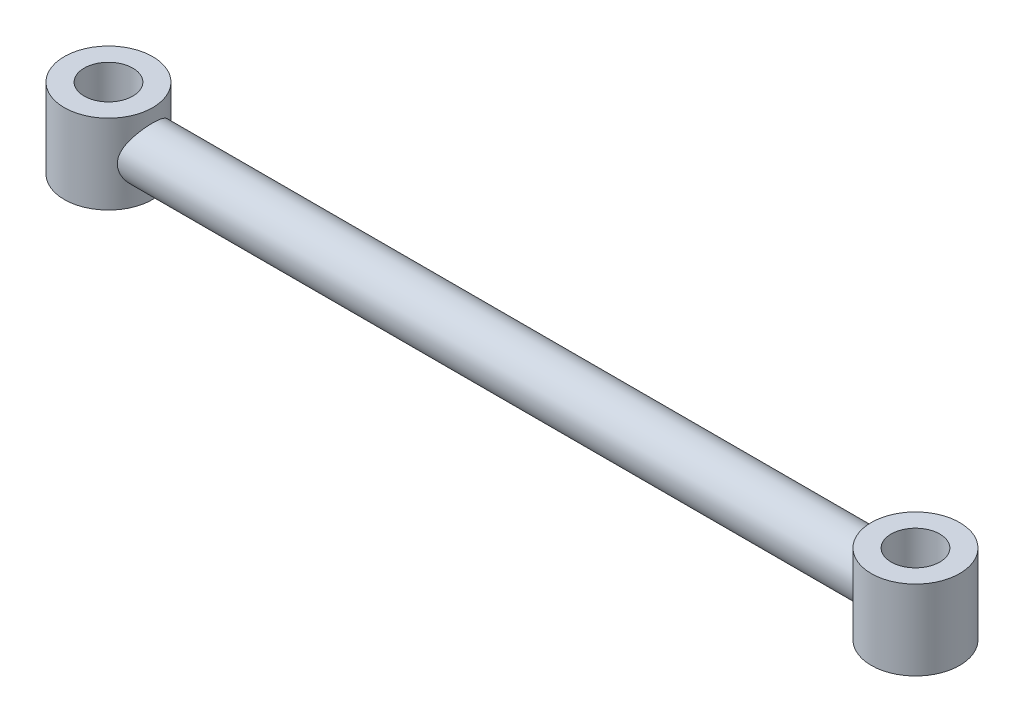
ISO-10303-21;
HEADER;
FILE_DESCRIPTION(('STEP AP214'),'2;1');
FILE_NAME('part.step','',(''),(''),'','','');
FILE_SCHEMA(('AUTOMOTIVE_DESIGN { 1 0 10303 214 1 1 1 1 }'));
ENDSEC;
DATA;
#1=APPLICATION_CONTEXT('core data for automotive mechanical design processes');
#2=APPLICATION_PROTOCOL_DEFINITION('international standard','automotive_design',2000,#1);
#3=PRODUCT_CONTEXT('',#1,'mechanical');
#4=PRODUCT('Part','Part','',(#3));
#5=PRODUCT_RELATED_PRODUCT_CATEGORY('part','',(#4));
#6=PRODUCT_DEFINITION_FORMATION('','',#4);
#7=PRODUCT_DEFINITION_CONTEXT('part definition',#1,'design');
#8=PRODUCT_DEFINITION('design','',#6,#7);
#9=PRODUCT_DEFINITION_SHAPE('','',#8);
#10=(LENGTH_UNIT() NAMED_UNIT(*) SI_UNIT(.MILLI.,.METRE.));
#11=(NAMED_UNIT(*) PLANE_ANGLE_UNIT() SI_UNIT($,.RADIAN.));
#12=(NAMED_UNIT(*) SI_UNIT($,.STERADIAN.) SOLID_ANGLE_UNIT());
#13=UNCERTAINTY_MEASURE_WITH_UNIT(LENGTH_MEASURE(1.E-05),#10,'distance_accuracy_value','');
#14=(GEOMETRIC_REPRESENTATION_CONTEXT(3) GLOBAL_UNCERTAINTY_ASSIGNED_CONTEXT((#13)) GLOBAL_UNIT_ASSIGNED_CONTEXT((#10,
#11,#12)) REPRESENTATION_CONTEXT('',''));
#15=CARTESIAN_POINT('',(0.,0.,0.));
#16=DIRECTION('',(0.,0.,1.));
#17=DIRECTION('',(1.,0.,0.));
#18=AXIS2_PLACEMENT_3D('',#15,#16,#17);
#19=CARTESIAN_POINT('',(182.5,0.,0.));
#20=DIRECTION('',(-1.,0.,0.));
#21=DIRECTION('',(0.,0.,1.));
#22=AXIS2_PLACEMENT_3D('',#19,#20,#21);
#23=CYLINDRICAL_SURFACE('',#22,12.);
#24=CARTESIAN_POINT('',(166.5,0.,12.));
#25=CARTESIAN_POINT('',(166.500002828967,-0.301908400688165,12.0000019238863));
#26=CARTESIAN_POINT('',(166.491423778045,-0.603795511520365,11.9885900087755));
#27=CARTESIAN_POINT('',(166.457502284021,-1.20488924542274,11.9431600202484));
#28=CARTESIAN_POINT('',(166.432160956955,-1.50409604560474,11.9091434518566));
#29=CARTESIAN_POINT('',(166.365779977744,-2.09765466722186,11.8190547923861));
#30=CARTESIAN_POINT('',(166.324725981522,-2.39200179539109,11.7629625471233));
#31=CARTESIAN_POINT('',(166.228571023156,-2.97349307991005,11.6295889328939));
#32=CARTESIAN_POINT('',(166.173469326672,-3.2606368588455,11.5523064562006));
#33=CARTESIAN_POINT('',(166.05168053024,-3.82391010602119,11.3782233898699));
#34=CARTESIAN_POINT('',(165.985083944408,-4.10010631241352,11.2815744063395));
#35=CARTESIAN_POINT('',(165.842106390334,-4.64262215814439,11.069369621002));
#36=CARTESIAN_POINT('',(165.765721522804,-4.90893780661706,10.9538062793017));
#37=CARTESIAN_POINT('',(165.605320398224,-5.43063769131154,10.7047527337694));
#38=CARTESIAN_POINT('',(165.521304115564,-5.68602189084302,10.5712624697737));
#39=CARTESIAN_POINT('',(165.347720367253,-6.18509809639777,10.2872252569974));
#40=CARTESIAN_POINT('',(165.258153262676,-6.4287908611111,10.1366794171379));
#41=CARTESIAN_POINT('',(165.064247886216,-6.93296744164812,9.7998357530252));
#42=CARTESIAN_POINT('',(164.959443242611,-7.19185705595307,9.61141728863257));
#43=CARTESIAN_POINT('',(164.747945976981,-7.6933159594402,9.21493722581117));
#44=CARTESIAN_POINT('',(164.641253227829,-7.93588414437564,9.00687430059582));
#45=CARTESIAN_POINT('',(164.428363009524,-8.40402030337025,8.57173550519701));
#46=CARTESIAN_POINT('',(164.322166073095,-8.62957276681466,8.34464267698865));
#47=CARTESIAN_POINT('',(164.112764143814,-9.06235556929377,7.87249861734411));
#48=CARTESIAN_POINT('',(164.009558136086,-9.26959217333667,7.62745357939243));
#49=CARTESIAN_POINT('',(163.797439169499,-9.68614025039818,7.092648996584));
#50=CARTESIAN_POINT('',(163.689121083317,-9.89323949346852,6.80092220851909));
#51=CARTESIAN_POINT('',(163.4818473623,-10.2818845047161,6.19770739835052));
#52=CARTESIAN_POINT('',(163.382892578599,-10.4634279505762,5.88621758405922));
#53=CARTESIAN_POINT('',(163.197247883637,-10.7988768856772,5.24546661918502));
#54=CARTESIAN_POINT('',(163.110549431346,-10.9528016418071,4.91621806733496));
#55=CARTESIAN_POINT('',(162.951983247807,-11.2311195931322,4.24203715195801));
#56=CARTESIAN_POINT('',(162.880113079609,-11.3555176413926,3.89710737694668));
#57=CARTESIAN_POINT('',(162.759569334717,-11.5624812778385,3.22795776425264));
#58=CARTESIAN_POINT('',(162.709336763554,-11.6479057862703,2.90490213290751));
#59=CARTESIAN_POINT('',(162.624324220016,-11.7917710665595,2.25082759614568));
#60=CARTESIAN_POINT('',(162.589543351758,-11.8502134028396,1.91980915358284));
#61=CARTESIAN_POINT('',(162.536488129066,-11.9391406335387,1.25298686812477));
#62=CARTESIAN_POINT('',(162.518200850477,-11.9696474181686,0.917186981873278));
#63=CARTESIAN_POINT('',(162.49864927495,-12.0022585112917,0.243729085676189));
#64=CARTESIAN_POINT('',(162.497383246063,-12.0043657095045,-0.0939287317231014));
#65=CARTESIAN_POINT('',(162.510998662594,-11.9816620001252,-0.725958119822381));
#66=CARTESIAN_POINT('',(162.523894673691,-11.9601608950351,-1.02049867081488));
#67=CARTESIAN_POINT('',(162.562452249791,-11.8956497579643,-1.60634317671335));
#68=CARTESIAN_POINT('',(162.588112499583,-11.8526419420081,-1.89764746191961));
#69=CARTESIAN_POINT('',(162.651609133523,-11.7456574840718,-2.47502497127977));
#70=CARTESIAN_POINT('',(162.689445954131,-11.681680090454,-2.76109800753568));
#71=CARTESIAN_POINT('',(162.776456076012,-11.5335067985196,-3.32619184187788));
#72=CARTESIAN_POINT('',(162.825629844392,-11.449310067115,-3.60521234885843));
#73=CARTESIAN_POINT('',(162.934570954697,-11.2610805390842,-4.15611235529148));
#74=CARTESIAN_POINT('',(162.994395222524,-11.1569409112312,-4.42794398767527));
#75=CARTESIAN_POINT('',(163.123258799191,-10.9300876072086,-4.96158056062547));
#76=CARTESIAN_POINT('',(163.192301385931,-10.8073673219387,-5.22338189174885));
#77=CARTESIAN_POINT('',(163.3382427822,-10.5444249206125,-5.73567682875735));
#78=CARTESIAN_POINT('',(163.415140075837,-10.4042061804551,-5.98617260311445));
#79=CARTESIAN_POINT('',(163.575420774502,-10.1071922231712,-6.47506872936967));
#80=CARTESIAN_POINT('',(163.658806501249,-9.9503910651754,-6.71346470077727));
#81=CARTESIAN_POINT('',(163.84082877763,-9.60153051105111,-7.2049947479175));
#82=CARTESIAN_POINT('',(163.940098019099,-9.40749645244502,-7.45649461200061));
#83=CARTESIAN_POINT('',(164.142773675002,-9.00104402075896,-7.94238968684768));
#84=CARTESIAN_POINT('',(164.246180395382,-8.788624286791,-8.17678362907875));
#85=CARTESIAN_POINT('',(164.455066071919,-8.34612135221813,-8.62799224234946));
#86=CARTESIAN_POINT('',(164.560547796082,-8.11601317196708,-8.8447811295483));
#87=CARTESIAN_POINT('',(164.771080063517,-7.63939133410778,-9.25956168795246));
#88=CARTESIAN_POINT('',(164.876130720468,-7.39288234224229,-9.45755866656125));
#89=CARTESIAN_POINT('',(165.095439038822,-6.85463170108886,-9.85590025313088));
#90=CARTESIAN_POINT('',(165.209347630861,-6.5609628730421,-10.053842826191));
#91=CARTESIAN_POINT('',(165.429993532283,-5.95522167682575,-10.4240751420533));
#92=CARTESIAN_POINT('',(165.536729660883,-5.64314629423663,-10.5963606666551));
#93=CARTESIAN_POINT('',(165.73896914915,-5.00243922366782,-10.913439641307));
#94=CARTESIAN_POINT('',(165.834489257744,-4.67383329669938,-11.0582742877405));
#95=CARTESIAN_POINT('',(166.010411997374,-4.00145187975437,-11.3189334736486));
#96=CARTESIAN_POINT('',(166.090820563945,-3.65768241152237,-11.4347694092443));
#97=CARTESIAN_POINT('',(166.215017364332,-3.04421360115854,-11.610679227564));
#98=CARTESIAN_POINT('',(166.262943010653,-2.7772577564668,-11.6774582470828));
#99=CARTESIAN_POINT('',(166.346496360172,-2.23756206684686,-11.7927693223011));
#100=CARTESIAN_POINT('',(166.382126787049,-1.9648235171511,-11.8413054194481));
#101=CARTESIAN_POINT('',(166.439829514199,-1.41548658277408,-11.9194501178543));
#102=CARTESIAN_POINT('',(166.461914828154,-1.13889216487325,-11.9490768876656));
#103=CARTESIAN_POINT('',(166.491763603535,-0.583526491869241,-11.9890365294492));
#104=CARTESIAN_POINT('',(166.499526761228,-0.304755190726258,-11.9993689922423));
#105=CARTESIAN_POINT('',(166.500431770705,0.253237187593743,-12.0005757169308));
#106=CARTESIAN_POINT('',(166.493553494723,0.53245835597042,-11.9914231925614));
#107=CARTESIAN_POINT('',(166.465400259443,1.08885114664406,-11.9537507574613));
#108=CARTESIAN_POINT('',(166.444125225159,1.36602275825806,-11.9252307458526));
#109=CARTESIAN_POINT('',(166.387953795293,1.91652811099207,-11.8492273938988));
#110=CARTESIAN_POINT('',(166.353048249553,2.18985914597287,-11.8017313144283));
#111=CARTESIAN_POINT('',(166.270838588812,2.73078140678314,-11.6884218683725));
#112=CARTESIAN_POINT('',(166.223534125508,2.99837247114031,-11.6226079872113));
#113=CARTESIAN_POINT('',(166.118125357712,3.52598231681507,-11.4735560828406));
#114=CARTESIAN_POINT('',(166.060038093048,3.78601230703067,-11.3903455253838));
#115=CARTESIAN_POINT('',(165.934660962492,4.29791560248682,-11.2072231395973));
#116=CARTESIAN_POINT('',(165.867368081331,4.54978620157477,-11.1073058366358));
#117=CARTESIAN_POINT('',(165.725307540906,5.04444759186843,-10.8915731783922));
#118=CARTESIAN_POINT('',(165.650539346416,5.28723773120911,-10.775756684521));
#119=CARTESIAN_POINT('',(165.495228731342,5.76305724420511,-10.5289606559558));
#120=CARTESIAN_POINT('',(165.41468599606,5.99608608479612,-10.3979802946296));
#121=CARTESIAN_POINT('',(165.23454449726,6.49298270755893,-10.0965427477609));
#122=CARTESIAN_POINT('',(165.134130183473,6.75482499152477,-9.92322733749157));
#123=CARTESIAN_POINT('',(164.930112321563,7.26327586936484,-9.55734884117474));
#124=CARTESIAN_POINT('',(164.826509294188,7.50988693107224,-9.36478888652449));
#125=CARTESIAN_POINT('',(164.618386928431,7.98738394680929,-8.9610015580484));
#126=CARTESIAN_POINT('',(164.513866775548,8.21825388811033,-8.7497556631375));
#127=CARTESIAN_POINT('',(164.306288128255,8.66313204976566,-8.30951773338647));
#128=CARTESIAN_POINT('',(164.203229709788,8.8771393966482,-8.08052478047704));
#129=CARTESIAN_POINT('',(163.98755313403,9.31404007325761,-7.57459119140597));
#130=CARTESIAN_POINT('',(163.875438259814,9.53446002805125,-7.29529028077707));
#131=CARTESIAN_POINT('',(163.658864142421,9.95088052545973,-6.71618728275076));
#132=CARTESIAN_POINT('',(163.554405683304,10.1468785685664,-6.41638310176176));
#133=CARTESIAN_POINT('',(163.356092814026,10.512504885732,-5.79794763548483));
#134=CARTESIAN_POINT('',(163.262233341347,10.6821457637524,-5.47932545017127));
#135=CARTESIAN_POINT('',(163.087811564895,10.993163432372,-4.82508968441392));
#136=CARTESIAN_POINT('',(163.007247448531,11.1345440763211,-4.4894784283018));
#137=CARTESIAN_POINT('',(162.867193825242,11.3778836757959,-3.82865235869636));
#138=CARTESIAN_POINT('',(162.806598863199,11.4819596087315,-3.50445198667871));
#139=CARTESIAN_POINT('',(162.700723587406,11.6626203187524,-2.84601413660251));
#140=CARTESIAN_POINT('',(162.655442703987,11.7392061184527,-2.51177703240517));
#141=CARTESIAN_POINT('',(162.581602248055,11.8636029123524,-1.83648767445476));
#142=CARTESIAN_POINT('',(162.553026927423,11.911441007835,-1.49544215364405));
#143=CARTESIAN_POINT('',(162.513437970259,11.9776197892116,-0.809503452327046));
#144=CARTESIAN_POINT('',(162.502422044393,11.9959643203756,-0.464610779304203));
#145=CARTESIAN_POINT('',(162.498568153475,12.0023854738157,0.179455347832177));
#146=CARTESIAN_POINT('',(162.503500102786,11.9941753490818,0.478586599494673));
#147=CARTESIAN_POINT('',(162.526676343111,11.95549677696,1.07486280744656));
#148=CARTESIAN_POINT('',(162.544919192077,11.9250307406838,1.37200797538116));
#149=CARTESIAN_POINT('',(162.594279638013,11.8422465516967,1.96213810956105));
#150=CARTESIAN_POINT('',(162.625397145158,11.7899285514456,2.25512310481685));
#151=CARTESIAN_POINT('',(162.699782501151,11.6640981837945,2.83492894826243));
#152=CARTESIAN_POINT('',(162.743050714151,11.5905851811864,3.12174961143206));
#153=CARTESIAN_POINT('',(162.839981044523,11.4245704054237,3.68285438672594));
#154=CARTESIAN_POINT('',(162.893464258702,11.3323940332569,3.95726608711425));
#155=CARTESIAN_POINT('',(163.010153824482,11.1292862018814,4.49689980989541));
#156=CARTESIAN_POINT('',(163.073359936012,11.0183552057406,4.76212205898894));
#157=CARTESIAN_POINT('',(163.208262727439,10.7787258735032,5.28214279400182));
#158=CARTESIAN_POINT('',(163.27995906437,10.6500282550613,5.53694170041705));
#159=CARTESIAN_POINT('',(163.430544737693,10.3758015523862,6.03520075148304));
#160=CARTESIAN_POINT('',(163.509436676335,10.2302663737908,6.27865674555706));
#161=CARTESIAN_POINT('',(163.681854860864,9.90673029466417,6.77899616744094));
#162=CARTESIAN_POINT('',(163.776041000191,9.72692044563403,7.03448334572756));
#163=CARTESIAN_POINT('',(163.969586441422,9.348935360204,7.52957259033478));
#164=CARTESIAN_POINT('',(164.068948052154,9.15075189586933,7.76916745668792));
#165=CARTESIAN_POINT('',(164.270849038489,8.73696672133491,8.23175510218865));
#166=CARTESIAN_POINT('',(164.373390935028,8.52135096358474,8.45473420807131));
#167=CARTESIAN_POINT('',(164.579446849445,8.07376590231618,8.88314617589317));
#168=CARTESIAN_POINT('',(164.682960919514,7.84179571643316,9.08857808979053));
#169=CARTESIAN_POINT('',(164.901799698455,7.33186369501143,9.50608800522032));
#170=CARTESIAN_POINT('',(165.016955336288,7.05180187068934,9.71569839772613));
#171=CARTESIAN_POINT('',(165.24227883175,6.47302014608167,10.110526392104));
#172=CARTESIAN_POINT('',(165.352446082999,6.17429798793025,10.2957410336743));
#173=CARTESIAN_POINT('',(165.564113623133,5.55945257539292,10.6403306545097));
#174=CARTESIAN_POINT('',(165.665616206628,5.24333396470237,10.7997124850301));
#175=CARTESIAN_POINT('',(165.85610626905,4.59511438969121,11.0910374795193));
#176=CARTESIAN_POINT('',(165.945097146565,4.26301779853903,11.2229880993829));
#177=CARTESIAN_POINT('',(166.099761007668,3.61366723599436,11.4476706777274));
#178=CARTESIAN_POINT('',(166.166774787697,3.29755988906652,11.5427864370199));
#179=CARTESIAN_POINT('',(166.284176385264,2.65563921316369,11.7071473361555));
#180=CARTESIAN_POINT('',(166.334565559927,2.32982667882558,11.7763945877959));
#181=CARTESIAN_POINT('',(166.416199252775,1.67181932077724,11.8876462704885));
#182=CARTESIAN_POINT('',(166.447479356206,1.33963755562275,11.929701347867));
#183=CARTESIAN_POINT('',(166.489376856324,0.671628104783217,11.9858753847844));
#184=CARTESIAN_POINT('',(166.499996853451,0.33580088329448,11.9999978601366));
#185=CARTESIAN_POINT('',(166.5,0.,12.));
#186=B_SPLINE_CURVE_WITH_KNOTS('',3,(#24,#25,#26,#27,#28,#29,#30,#31,#32,#33,#34,#35,#36,#37,
#38,#39,#40,#41,#42,#43,#44,#45,#46,#47,#48,#49,#50,#51,#52,#53,#54,#55,#56,#57,#58,#59,#60,#61,
#62,#63,#64,#65,#66,#67,#68,#69,#70,#71,#72,#73,#74,#75,#76,#77,#78,#79,#80,#81,#82,#83,#84,#85,
#86,#87,#88,#89,#90,#91,#92,#93,#94,#95,#96,#97,#98,#99,#100,#101,#102,#103,#104,#105,#106,#107,
#108,#109,#110,#111,#112,#113,#114,#115,#116,#117,#118,#119,#120,#121,#122,#123,#124,#125,#126,
#127,#128,#129,#130,#131,#132,#133,#134,#135,#136,#137,#138,#139,#140,#141,#142,#143,#144,#145,
#146,#147,#148,#149,#150,#151,#152,#153,#154,#155,#156,#157,#158,#159,#160,#161,#162,#163,#164,
#165,#166,#167,#168,#169,#170,#171,#172,#173,#174,#175,#176,#177,#178,#179,#180,#181,#182,#183,
#184,#185),.UNSPECIFIED.,.T.,.F.,(4,2,2,2,2,2,2,2,2,2,2,2,2,2,2,2,2,2,2,2,2,2,2,2,2,2,2,2,2,2,2,
2,2,2,2,2,2,2,2,2,2,2,2,2,2,2,2,2,2,2,2,2,2,2,2,2,2,2,2,2,2,2,2,2,2,2,2,2,2,2,2,2,2,2,2,2,2,2,2,
2,4),(0.,0.905356263906157,1.81065225495962,2.71677666841302,3.62294845886141,4.5222857029527,
5.42198232992236,6.32168197639813,7.22132315964398,8.23104850867394,9.24084210338854,
10.2515453198908,11.2619014726687,12.3818273656142,13.5018549633308,14.6210981623429,
15.7401572728519,16.752441440934,17.7646669095416,18.7760985210015,19.7874272163241,
20.673184190002,21.5588499151895,22.4445473898195,23.3302813636901,24.2208999819286,
25.1118361387938,26.0026006762698,26.8936854299543,27.8910660053599,28.8885204690439,
29.8874103738016,30.8860173170441,32.0006941039487,33.1155539497671,34.2287272083442,
35.3414623149551,36.1785892140744,37.0155305507444,37.8516665179444,38.6878202170862,
39.5251241297566,40.3624324036609,41.2003037313291,42.0381985984997,42.8747804598504,
43.7116369998239,44.5485535009134,45.3855156465696,46.3735461495525,47.3614161450078,
48.3502765083028,49.3391880603129,50.456908004688,51.5747422504905,52.6920402932018,
53.8091858855997,54.8452180584315,55.881211687547,56.9162271173945,57.9511075945252,
58.8478548614564,59.7445049929725,60.6411488687215,61.5378196194258,62.4200276697994,
63.3022139408792,64.1843645878562,65.0668355344903,66.044765107921,67.0231347454681,
68.002300799585,68.9815197227868,70.0850618258241,71.1887377150264,72.2921204118897,
73.3952028124034,74.4042890325313,75.413292857043,76.4204119233386,77.427404217766),.UNSPECIFIED.);
#187=CARTESIAN_POINT('',(166.5,0.,12.));
#188=VERTEX_POINT('',#187);
#189=EDGE_CURVE('E43',#188,#188,#186,.T.);
#190=ORIENTED_EDGE('',*,*,#189,.F.);
#191=EDGE_LOOP('',(#190));
#192=FACE_BOUND('',#191,.T.);
#193=CARTESIAN_POINT('',(-166.5,0.,12.));
#194=CARTESIAN_POINT('',(-166.500002828967,0.301908400688168,12.0000019238863));
#195=CARTESIAN_POINT('',(-166.491423778045,0.603795511520371,11.9885900087755));
#196=CARTESIAN_POINT('',(-166.457502284021,1.20488924542275,11.9431600202484));
#197=CARTESIAN_POINT('',(-166.432160956955,1.50409604560475,11.9091434518566));
#198=CARTESIAN_POINT('',(-166.365779977743,2.09765466722188,11.8190547923861));
#199=CARTESIAN_POINT('',(-166.324725981522,2.39200179539111,11.7629625471233));
#200=CARTESIAN_POINT('',(-166.228571023155,2.97349307991007,11.6295889328939));
#201=CARTESIAN_POINT('',(-166.173469326672,3.26063685884552,11.5523064562006));
#202=CARTESIAN_POINT('',(-166.05168053024,3.82391010602121,11.3782233898699));
#203=CARTESIAN_POINT('',(-165.985083944408,4.10010631241354,11.2815744063395));
#204=CARTESIAN_POINT('',(-165.842106390334,4.64262215814441,11.069369621002));
#205=CARTESIAN_POINT('',(-165.765721522803,4.90893780661708,10.9538062793017));
#206=CARTESIAN_POINT('',(-165.605320398224,5.43063769131156,10.7047527337694));
#207=CARTESIAN_POINT('',(-165.521304115564,5.68602189084304,10.5712624697737));
#208=CARTESIAN_POINT('',(-165.347720367252,6.18509809639779,10.2872252569974));
#209=CARTESIAN_POINT('',(-165.258153262676,6.42879086111113,10.1366794171379));
#210=CARTESIAN_POINT('',(-165.064247886216,6.93296744164815,9.79983575302517));
#211=CARTESIAN_POINT('',(-164.959443242611,7.1918570559531,9.61141728863255));
#212=CARTESIAN_POINT('',(-164.74794597698,7.69331595944023,9.21493722581114));
#213=CARTESIAN_POINT('',(-164.641253227828,7.93588414437566,9.0068743005958));
#214=CARTESIAN_POINT('',(-164.428363009524,8.40402030337027,8.57173550519699));
#215=CARTESIAN_POINT('',(-164.322166073095,8.62957276681468,8.34464267698862));
#216=CARTESIAN_POINT('',(-164.112764143813,9.0623555692938,7.87249861734408));
#217=CARTESIAN_POINT('',(-164.009558136085,9.26959217333669,7.62745357939239));
#218=CARTESIAN_POINT('',(-163.797439169498,9.68614025039821,7.09264899658396));
#219=CARTESIAN_POINT('',(-163.689121083317,9.89323949346856,6.80092220851904));
#220=CARTESIAN_POINT('',(-163.4818473623,10.2818845047161,6.19770739835046));
#221=CARTESIAN_POINT('',(-163.382892578599,10.4634279505762,5.88621758405916));
#222=CARTESIAN_POINT('',(-163.197247883637,10.7988768856772,5.24546661918496));
#223=CARTESIAN_POINT('',(-163.110549431346,10.9528016418072,4.9162180673349));
#224=CARTESIAN_POINT('',(-162.951983247807,11.2311195931322,4.24203715195794));
#225=CARTESIAN_POINT('',(-162.880113079608,11.3555176413926,3.89710737694662));
#226=CARTESIAN_POINT('',(-162.759569334717,11.5624812778385,3.22795776425259));
#227=CARTESIAN_POINT('',(-162.709336763554,11.6479057862703,2.90490213290745));
#228=CARTESIAN_POINT('',(-162.624324220016,11.7917710665595,2.25082759614563));
#229=CARTESIAN_POINT('',(-162.589543351758,11.8502134028396,1.91980915358279));
#230=CARTESIAN_POINT('',(-162.536488129066,11.9391406335387,1.25298686812473));
#231=CARTESIAN_POINT('',(-162.518200850476,11.9696474181686,0.917186981873233));
#232=CARTESIAN_POINT('',(-162.498649274949,12.0022585112917,0.243729085676149));
#233=CARTESIAN_POINT('',(-162.497383246063,12.0043657095045,-0.0939287317231403));
#234=CARTESIAN_POINT('',(-162.510998662594,11.9816620001252,-0.725958119822416));
#235=CARTESIAN_POINT('',(-162.523894673691,11.9601608950351,-1.02049867081491));
#236=CARTESIAN_POINT('',(-162.562452249791,11.8956497579643,-1.60634317671338));
#237=CARTESIAN_POINT('',(-162.588112499582,11.8526419420081,-1.89764746191964));
#238=CARTESIAN_POINT('',(-162.651609133523,11.7456574840718,-2.4750249712798));
#239=CARTESIAN_POINT('',(-162.689445954131,11.681680090454,-2.7610980075357));
#240=CARTESIAN_POINT('',(-162.776456076011,11.5335067985196,-3.3261918418779));
#241=CARTESIAN_POINT('',(-162.825629844392,11.449310067115,-3.60521234885845));
#242=CARTESIAN_POINT('',(-162.934570954697,11.2610805390842,-4.1561123552915));
#243=CARTESIAN_POINT('',(-162.994395222523,11.1569409112312,-4.42794398767527));
#244=CARTESIAN_POINT('',(-163.12325879919,10.9300876072086,-4.96158056062547));
#245=CARTESIAN_POINT('',(-163.192301385931,10.8073673219387,-5.22338189174884));
#246=CARTESIAN_POINT('',(-163.3382427822,10.5444249206125,-5.73567682875734));
#247=CARTESIAN_POINT('',(-163.415140075837,10.4042061804551,-5.98617260311445));
#248=CARTESIAN_POINT('',(-163.575420774502,10.1071922231712,-6.47506872936966));
#249=CARTESIAN_POINT('',(-163.658806501249,9.95039106517539,-6.71346470077727));
#250=CARTESIAN_POINT('',(-163.84082877763,9.6015305110511,-7.2049947479175));
#251=CARTESIAN_POINT('',(-163.940098019099,9.40749645244501,-7.45649461200062));
#252=CARTESIAN_POINT('',(-164.142773675002,9.00104402075895,-7.94238968684769));
#253=CARTESIAN_POINT('',(-164.246180395382,8.78862428679099,-8.17678362907875));
#254=CARTESIAN_POINT('',(-164.455066071919,8.34612135221813,-8.62799224234945));
#255=CARTESIAN_POINT('',(-164.560547796082,8.11601317196708,-8.84478112954829));
#256=CARTESIAN_POINT('',(-164.771080063517,7.63939133410779,-9.25956168795245));
#257=CARTESIAN_POINT('',(-164.876130720467,7.3928823422423,-9.45755866656125));
#258=CARTESIAN_POINT('',(-165.095439038822,6.85463170108886,-9.85590025313088));
#259=CARTESIAN_POINT('',(-165.209347630861,6.5609628730421,-10.053842826191));
#260=CARTESIAN_POINT('',(-165.429993532283,5.95522167682576,-10.4240751420533));
#261=CARTESIAN_POINT('',(-165.536729660883,5.64314629423664,-10.5963606666551));
#262=CARTESIAN_POINT('',(-165.738969149149,5.00243922366784,-10.913439641307));
#263=CARTESIAN_POINT('',(-165.834489257744,4.6738332966994,-11.0582742877405));
#264=CARTESIAN_POINT('',(-166.010411997374,4.00145187975439,-11.3189334736486));
#265=CARTESIAN_POINT('',(-166.090820563945,3.6576824115224,-11.4347694092443));
#266=CARTESIAN_POINT('',(-166.215017364332,3.04421360115857,-11.610679227564));
#267=CARTESIAN_POINT('',(-166.262943010653,2.77725775646683,-11.6774582470828));
#268=CARTESIAN_POINT('',(-166.346496360171,2.23756206684689,-11.7927693223011));
#269=CARTESIAN_POINT('',(-166.382126787049,1.96482351715113,-11.8413054194481));
#270=CARTESIAN_POINT('',(-166.439829514199,1.4154865827741,-11.9194501178543));
#271=CARTESIAN_POINT('',(-166.461914828154,1.13889216487327,-11.9490768876656));
#272=CARTESIAN_POINT('',(-166.491763603535,0.58352649186926,-11.9890365294492));
#273=CARTESIAN_POINT('',(-166.499526761228,0.304755190726272,-11.9993689922423));
#274=CARTESIAN_POINT('',(-166.500431770705,-0.253237187593736,-12.0005757169308));
#275=CARTESIAN_POINT('',(-166.493553494723,-0.532458355970414,-11.9914231925614));
#276=CARTESIAN_POINT('',(-166.465400259443,-1.08885114664406,-11.9537507574613));
#277=CARTESIAN_POINT('',(-166.444125225158,-1.36602275825806,-11.9252307458526));
#278=CARTESIAN_POINT('',(-166.387953795293,-1.91652811099207,-11.8492273938988));
#279=CARTESIAN_POINT('',(-166.353048249553,-2.18985914597288,-11.8017313144283));
#280=CARTESIAN_POINT('',(-166.270838588812,-2.73078140678316,-11.6884218683725));
#281=CARTESIAN_POINT('',(-166.223534125507,-2.99837247114033,-11.6226079872113));
#282=CARTESIAN_POINT('',(-166.118125357712,-3.5259823168151,-11.4735560828406));
#283=CARTESIAN_POINT('',(-166.060038093048,-3.7860123070307,-11.3903455253838));
#284=CARTESIAN_POINT('',(-165.934660962492,-4.29791560248685,-11.2072231395972));
#285=CARTESIAN_POINT('',(-165.867368081331,-4.5497862015748,-11.1073058366358));
#286=CARTESIAN_POINT('',(-165.725307540906,-5.04444759186846,-10.8915731783922));
#287=CARTESIAN_POINT('',(-165.650539346416,-5.28723773120914,-10.775756684521));
#288=CARTESIAN_POINT('',(-165.495228731342,-5.76305724420515,-10.5289606559557));
#289=CARTESIAN_POINT('',(-165.414685996059,-5.99608608479615,-10.3979802946295));
#290=CARTESIAN_POINT('',(-165.23454449726,-6.49298270755896,-10.0965427477609));
#291=CARTESIAN_POINT('',(-165.134130183473,-6.7548249915248,-9.92322733749155));
#292=CARTESIAN_POINT('',(-164.930112321563,-7.26327586936487,-9.55734884117472));
#293=CARTESIAN_POINT('',(-164.826509294188,-7.50988693107227,-9.36478888652446));
#294=CARTESIAN_POINT('',(-164.618386928431,-7.98738394680933,-8.96100155804837));
#295=CARTESIAN_POINT('',(-164.513866775548,-8.21825388811036,-8.74975566313746));
#296=CARTESIAN_POINT('',(-164.306288128255,-8.6631320497657,-8.30951773338642));
#297=CARTESIAN_POINT('',(-164.203229709788,-8.87713939664824,-8.08052478047699));
#298=CARTESIAN_POINT('',(-163.987553134029,-9.31404007325765,-7.57459119140592));
#299=CARTESIAN_POINT('',(-163.875438259814,-9.5344600280513,-7.29529028077701));
#300=CARTESIAN_POINT('',(-163.658864142421,-9.95088052545977,-6.7161872827507));
#301=CARTESIAN_POINT('',(-163.554405683304,-10.1468785685664,-6.41638310176169));
#302=CARTESIAN_POINT('',(-163.356092814026,-10.512504885732,-5.79794763548477));
#303=CARTESIAN_POINT('',(-163.262233341347,-10.6821457637524,-5.47932545017122));
#304=CARTESIAN_POINT('',(-163.087811564895,-10.9931634323721,-4.82508968441386));
#305=CARTESIAN_POINT('',(-163.00724744853,-11.1345440763212,-4.48947842830174));
#306=CARTESIAN_POINT('',(-162.867193825241,-11.3778836757959,-3.82865235869629));
#307=CARTESIAN_POINT('',(-162.806598863199,-11.4819596087315,-3.50445198667865));
#308=CARTESIAN_POINT('',(-162.700723587406,-11.6626203187524,-2.84601413660245));
#309=CARTESIAN_POINT('',(-162.655442703986,-11.7392061184527,-2.51177703240512));
#310=CARTESIAN_POINT('',(-162.581602248054,-11.8636029123524,-1.83648767445471));
#311=CARTESIAN_POINT('',(-162.553026927423,-11.911441007835,-1.495442153644));
#312=CARTESIAN_POINT('',(-162.513437970258,-11.9776197892116,-0.809503452327003));
#313=CARTESIAN_POINT('',(-162.502422044393,-11.9959643203756,-0.464610779304162));
#314=CARTESIAN_POINT('',(-162.498568153475,-12.0023854738157,0.179455347832215));
#315=CARTESIAN_POINT('',(-162.503500102786,-11.9941753490818,0.478586599494709));
#316=CARTESIAN_POINT('',(-162.526676343111,-11.95549677696,1.07486280744659));
#317=CARTESIAN_POINT('',(-162.544919192077,-11.9250307406838,1.37200797538119));
#318=CARTESIAN_POINT('',(-162.594279638013,-11.8422465516967,1.96213810956108));
#319=CARTESIAN_POINT('',(-162.625397145158,-11.7899285514456,2.25512310481687));
#320=CARTESIAN_POINT('',(-162.699782501151,-11.6640981837945,2.83492894826245));
#321=CARTESIAN_POINT('',(-162.743050714151,-11.5905851811863,3.12174961143208));
#322=CARTESIAN_POINT('',(-162.839981044523,-11.4245704054237,3.68285438672595));
#323=CARTESIAN_POINT('',(-162.893464258702,-11.3323940332569,3.95726608711426));
#324=CARTESIAN_POINT('',(-163.010153824481,-11.1292862018814,4.49689980989542));
#325=CARTESIAN_POINT('',(-163.073359936011,-11.0183552057406,4.76212205898894));
#326=CARTESIAN_POINT('',(-163.208262727439,-10.7787258735032,5.28214279400182));
#327=CARTESIAN_POINT('',(-163.27995906437,-10.6500282550613,5.53694170041704));
#328=CARTESIAN_POINT('',(-163.430544737693,-10.3758015523862,6.03520075148304));
#329=CARTESIAN_POINT('',(-163.509436676335,-10.2302663737908,6.27865674555707));
#330=CARTESIAN_POINT('',(-163.681854860864,-9.90673029466417,6.77899616744094));
#331=CARTESIAN_POINT('',(-163.776041000191,-9.72692044563402,7.03448334572757));
#332=CARTESIAN_POINT('',(-163.969586441422,-9.348935360204,7.52957259033479));
#333=CARTESIAN_POINT('',(-164.068948052154,-9.15075189586933,7.76916745668792));
#334=CARTESIAN_POINT('',(-164.270849038488,-8.73696672133491,8.23175510218865));
#335=CARTESIAN_POINT('',(-164.373390935027,-8.52135096358474,8.45473420807131));
#336=CARTESIAN_POINT('',(-164.579446849445,-8.07376590231618,8.88314617589317));
#337=CARTESIAN_POINT('',(-164.682960919514,-7.84179571643316,9.08857808979053));
#338=CARTESIAN_POINT('',(-164.901799698454,-7.33186369501143,9.50608800522032));
#339=CARTESIAN_POINT('',(-165.016955336288,-7.05180187068934,9.71569839772613));
#340=CARTESIAN_POINT('',(-165.242278831749,-6.47302014608166,10.110526392104));
#341=CARTESIAN_POINT('',(-165.352446082999,-6.17429798793025,10.2957410336743));
#342=CARTESIAN_POINT('',(-165.564113623133,-5.55945257539293,10.6403306545097));
#343=CARTESIAN_POINT('',(-165.665616206628,-5.24333396470239,10.7997124850301));
#344=CARTESIAN_POINT('',(-165.856106269049,-4.59511438969123,11.0910374795193));
#345=CARTESIAN_POINT('',(-165.945097146565,-4.26301779853904,11.2229880993829));
#346=CARTESIAN_POINT('',(-166.099761007667,-3.61366723599437,11.4476706777274));
#347=CARTESIAN_POINT('',(-166.166774787697,-3.29755988906652,11.5427864370199));
#348=CARTESIAN_POINT('',(-166.284176385264,-2.6556392131637,11.7071473361555));
#349=CARTESIAN_POINT('',(-166.334565559927,-2.32982667882559,11.7763945877959));
#350=CARTESIAN_POINT('',(-166.416199252775,-1.67181932077725,11.8876462704885));
#351=CARTESIAN_POINT('',(-166.447479356205,-1.33963755562276,11.929701347867));
#352=CARTESIAN_POINT('',(-166.489376856324,-0.671628104783226,11.9858753847844));
#353=CARTESIAN_POINT('',(-166.499996853451,-0.335800883294484,11.9999978601366));
#354=CARTESIAN_POINT('',(-166.5,0.,12.));
#355=B_SPLINE_CURVE_WITH_KNOTS('',3,(#193,#194,#195,#196,#197,#198,#199,#200,#201,#202,#203,
#204,#205,#206,#207,#208,#209,#210,#211,#212,#213,#214,#215,#216,#217,#218,#219,#220,#221,#222,
#223,#224,#225,#226,#227,#228,#229,#230,#231,#232,#233,#234,#235,#236,#237,#238,#239,#240,#241,
#242,#243,#244,#245,#246,#247,#248,#249,#250,#251,#252,#253,#254,#255,#256,#257,#258,#259,#260,
#261,#262,#263,#264,#265,#266,#267,#268,#269,#270,#271,#272,#273,#274,#275,#276,#277,#278,#279,
#280,#281,#282,#283,#284,#285,#286,#287,#288,#289,#290,#291,#292,#293,#294,#295,#296,#297,#298,
#299,#300,#301,#302,#303,#304,#305,#306,#307,#308,#309,#310,#311,#312,#313,#314,#315,#316,#317,
#318,#319,#320,#321,#322,#323,#324,#325,#326,#327,#328,#329,#330,#331,#332,#333,#334,#335,#336,
#337,#338,#339,#340,#341,#342,#343,#344,#345,#346,#347,#348,#349,#350,#351,#352,#353,#354),
.UNSPECIFIED.,.T.,.F.,(4,2,2,2,2,2,2,2,2,2,2,2,2,2,2,2,2,2,2,2,2,2,2,2,2,2,2,2,2,2,2,2,2,2,2,2,
2,2,2,2,2,2,2,2,2,2,2,2,2,2,2,2,2,2,2,2,2,2,2,2,2,2,2,2,2,2,2,2,2,2,2,2,2,2,2,2,2,2,2,2,4),(0.,
0.905356263906165,1.81065225495964,2.71677666841303,3.62294845886143,4.52228570295272,
5.42198232992239,6.32168197639815,7.22132315964402,8.23104850867396,9.24084210338859,
10.2515453198908,11.2619014726687,12.3818273656143,13.5018549633309,14.621098162343,
15.740157272852,16.7524414409341,17.7646669095416,18.7760985210015,19.7874272163242,
20.673184190002,21.5588499151895,22.4445473898196,23.3302813636901,24.2208999819286,
25.1118361387938,26.0026006762698,26.8936854299543,27.89106600536,28.8885204690439,
29.8874103738016,30.886017317044,32.0006941039486,33.1155539497671,34.2287272083442,
35.3414623149551,36.1785892140743,37.0155305507444,37.8516665179444,38.6878202170862,
39.5251241297566,40.3624324036609,41.2003037313291,42.0381985984997,42.8747804598504,
43.711636999824,44.5485535009134,45.3855156465697,46.3735461495525,47.3614161450079,
48.3502765083029,49.339188060313,50.4569080046881,51.5747422504906,52.6920402932019,
53.8091858855998,54.8452180584316,55.8812116875471,56.9162271173945,57.9511075945253,
58.8478548614565,59.7445049929726,60.6411488687216,61.5378196194258,62.4200276697995,
63.3022139408792,64.1843645878563,65.0668355344903,66.044765107921,67.0231347454682,
68.0023007995851,68.9815197227868,70.0850618258241,71.1887377150265,72.2921204118897,
73.3952028124034,74.4042890325313,75.413292857043,76.4204119233386,77.427404217766),.UNSPECIFIED.);
#356=CARTESIAN_POINT('',(-166.5,0.,12.));
#357=VERTEX_POINT('',#356);
#358=EDGE_CURVE('E10',#357,#357,#355,.T.);
#359=ORIENTED_EDGE('',*,*,#358,.F.);
#360=EDGE_LOOP('',(#359));
#361=FACE_BOUND('',#360,.T.);
#362=ADVANCED_FACE('F32',(#192,#361),#23,.T.);
#363=CARTESIAN_POINT('',(182.5,18.,0.));
#364=DIRECTION('',(0.,-1.,0.));
#365=DIRECTION('',(0.,0.,-1.));
#366=AXIS2_PLACEMENT_3D('',#363,#364,#365);
#367=CYLINDRICAL_SURFACE('',#366,20.);
#368=CARTESIAN_POINT('',(182.5,-18.,0.));
#369=DIRECTION('',(0.,1.,0.));
#370=DIRECTION('',(0.,0.,1.));
#371=AXIS2_PLACEMENT_3D('',#368,#369,#370);
#372=CIRCLE('',#371,20.);
#373=CARTESIAN_POINT('',(182.5,-18.,20.));
#374=VERTEX_POINT('',#373);
#375=EDGE_CURVE('E51',#374,#374,#372,.T.);
#376=ORIENTED_EDGE('',*,*,#375,.T.);
#377=EDGE_LOOP('',(#376));
#378=FACE_BOUND('',#377,.T.);
#379=CARTESIAN_POINT('',(182.5,18.,0.));
#380=DIRECTION('',(0.,1.,0.));
#381=DIRECTION('',(0.,0.,1.));
#382=AXIS2_PLACEMENT_3D('',#379,#380,#381);
#383=CIRCLE('',#382,20.);
#384=CARTESIAN_POINT('',(182.5,18.,20.));
#385=VERTEX_POINT('',#384);
#386=EDGE_CURVE('E47',#385,#385,#383,.T.);
#387=ORIENTED_EDGE('',*,*,#386,.F.);
#388=EDGE_LOOP('',(#387));
#389=FACE_BOUND('',#388,.T.);
#390=ORIENTED_EDGE('',*,*,#189,.T.);
#391=EDGE_LOOP('',(#390));
#392=FACE_BOUND('',#391,.T.);
#393=ADVANCED_FACE('F57',(#378,#389,#392),#367,.T.);
#394=CARTESIAN_POINT('',(182.5,18.,0.));
#395=DIRECTION('',(0.,1.,0.));
#396=DIRECTION('',(0.,0.,1.));
#397=AXIS2_PLACEMENT_3D('',#394,#395,#396);
#398=PLANE('',#397);
#399=CARTESIAN_POINT('',(182.5,18.,0.));
#400=DIRECTION('',(0.,1.,0.));
#401=DIRECTION('',(0.,0.,1.));
#402=AXIS2_PLACEMENT_3D('',#399,#400,#401);
#403=CIRCLE('',#402,11.);
#404=CARTESIAN_POINT('',(182.5,18.,11.));
#405=VERTEX_POINT('',#404);
#406=EDGE_CURVE('E152',#405,#405,#403,.F.);
#407=ORIENTED_EDGE('',*,*,#406,.T.);
#408=EDGE_LOOP('',(#407));
#409=FACE_BOUND('',#408,.T.);
#410=ORIENTED_EDGE('',*,*,#386,.T.);
#411=EDGE_LOOP('',(#410));
#412=FACE_BOUND('',#411,.T.);
#413=ADVANCED_FACE('F61',(#409,#412),#398,.T.);
#414=CARTESIAN_POINT('',(182.5,-18.,0.));
#415=DIRECTION('',(0.,1.,0.));
#416=DIRECTION('',(0.,0.,1.));
#417=AXIS2_PLACEMENT_3D('',#414,#415,#416);
#418=PLANE('',#417);
#419=CARTESIAN_POINT('',(182.5,-18.,0.));
#420=DIRECTION('',(0.,-1.,0.));
#421=DIRECTION('',(0.,0.,-1.));
#422=AXIS2_PLACEMENT_3D('',#419,#420,#421);
#423=CIRCLE('',#422,11.);
#424=CARTESIAN_POINT('',(182.5,-18.,-11.));
#425=VERTEX_POINT('',#424);
#426=EDGE_CURVE('E149',#425,#425,#423,.T.);
#427=ORIENTED_EDGE('',*,*,#426,.F.);
#428=EDGE_LOOP('',(#427));
#429=FACE_BOUND('',#428,.T.);
#430=ORIENTED_EDGE('',*,*,#375,.F.);
#431=EDGE_LOOP('',(#430));
#432=FACE_BOUND('',#431,.T.);
#433=ADVANCED_FACE('F63',(#429,#432),#418,.F.);
#434=CARTESIAN_POINT('',(-182.5,18.,0.));
#435=DIRECTION('',(0.,-1.,0.));
#436=DIRECTION('',(0.,0.,-1.));
#437=AXIS2_PLACEMENT_3D('',#434,#435,#436);
#438=CYLINDRICAL_SURFACE('',#437,20.);
#439=CARTESIAN_POINT('',(-182.5,-18.,0.));
#440=DIRECTION('',(0.,1.,0.));
#441=DIRECTION('',(0.,0.,1.));
#442=AXIS2_PLACEMENT_3D('',#439,#440,#441);
#443=CIRCLE('',#442,20.);
#444=CARTESIAN_POINT('',(-182.5,-18.,20.));
#445=VERTEX_POINT('',#444);
#446=EDGE_CURVE('E153',#445,#445,#443,.T.);
#447=ORIENTED_EDGE('',*,*,#446,.T.);
#448=EDGE_LOOP('',(#447));
#449=FACE_BOUND('',#448,.T.);
#450=CARTESIAN_POINT('',(-182.5,18.,0.));
#451=DIRECTION('',(0.,1.,0.));
#452=DIRECTION('',(0.,0.,1.));
#453=AXIS2_PLACEMENT_3D('',#450,#451,#452);
#454=CIRCLE('',#453,20.);
#455=CARTESIAN_POINT('',(-182.5,18.,20.));
#456=VERTEX_POINT('',#455);
#457=EDGE_CURVE('E156',#456,#456,#454,.T.);
#458=ORIENTED_EDGE('',*,*,#457,.F.);
#459=EDGE_LOOP('',(#458));
#460=FACE_BOUND('',#459,.T.);
#461=ORIENTED_EDGE('',*,*,#358,.T.);
#462=EDGE_LOOP('',(#461));
#463=FACE_BOUND('',#462,.T.);
#464=ADVANCED_FACE('F66',(#449,#460,#463),#438,.T.);
#465=CARTESIAN_POINT('',(-182.5,18.,0.));
#466=DIRECTION('',(0.,1.,0.));
#467=DIRECTION('',(0.,0.,1.));
#468=AXIS2_PLACEMENT_3D('',#465,#466,#467);
#469=PLANE('',#468);
#470=CARTESIAN_POINT('',(-182.5,18.,0.));
#471=DIRECTION('',(0.,1.,0.));
#472=DIRECTION('',(0.,0.,1.));
#473=AXIS2_PLACEMENT_3D('',#470,#471,#472);
#474=CIRCLE('',#473,11.);
#475=CARTESIAN_POINT('',(-182.5,18.,11.));
#476=VERTEX_POINT('',#475);
#477=EDGE_CURVE('E158',#476,#476,#474,.F.);
#478=ORIENTED_EDGE('',*,*,#477,.T.);
#479=EDGE_LOOP('',(#478));
#480=FACE_BOUND('',#479,.T.);
#481=ORIENTED_EDGE('',*,*,#457,.T.);
#482=EDGE_LOOP('',(#481));
#483=FACE_BOUND('',#482,.T.);
#484=ADVANCED_FACE('F73',(#480,#483),#469,.T.);
#485=CARTESIAN_POINT('',(-182.5,-18.,0.));
#486=DIRECTION('',(0.,1.,0.));
#487=DIRECTION('',(0.,0.,1.));
#488=AXIS2_PLACEMENT_3D('',#485,#486,#487);
#489=PLANE('',#488);
#490=CARTESIAN_POINT('',(-182.5,-18.,0.));
#491=DIRECTION('',(0.,-1.,0.));
#492=DIRECTION('',(0.,0.,-1.));
#493=AXIS2_PLACEMENT_3D('',#490,#491,#492);
#494=CIRCLE('',#493,11.);
#495=CARTESIAN_POINT('',(-182.5,-18.,-11.));
#496=VERTEX_POINT('',#495);
#497=EDGE_CURVE('E161',#496,#496,#494,.T.);
#498=ORIENTED_EDGE('',*,*,#497,.F.);
#499=EDGE_LOOP('',(#498));
#500=FACE_BOUND('',#499,.T.);
#501=ORIENTED_EDGE('',*,*,#446,.F.);
#502=EDGE_LOOP('',(#501));
#503=FACE_BOUND('',#502,.T.);
#504=ADVANCED_FACE('F75',(#500,#503),#489,.F.);
#505=CARTESIAN_POINT('',(-182.5,49.112698372208,0.));
#506=DIRECTION('',(0.,-1.,0.));
#507=DIRECTION('',(0.,0.,-1.));
#508=AXIS2_PLACEMENT_3D('',#505,#506,#507);
#509=CYLINDRICAL_SURFACE('',#508,11.);
#510=ORIENTED_EDGE('',*,*,#497,.T.);
#511=EDGE_LOOP('',(#510));
#512=FACE_BOUND('',#511,.T.);
#513=ORIENTED_EDGE('',*,*,#477,.F.);
#514=EDGE_LOOP('',(#513));
#515=FACE_BOUND('',#514,.T.);
#516=ADVANCED_FACE('F78',(#512,#515),#509,.F.);
#517=CARTESIAN_POINT('',(182.5,49.112698372208,0.));
#518=DIRECTION('',(0.,-1.,0.));
#519=DIRECTION('',(0.,0.,-1.));
#520=AXIS2_PLACEMENT_3D('',#517,#518,#519);
#521=CYLINDRICAL_SURFACE('',#520,11.);
#522=ORIENTED_EDGE('',*,*,#426,.T.);
#523=EDGE_LOOP('',(#522));
#524=FACE_BOUND('',#523,.T.);
#525=ORIENTED_EDGE('',*,*,#406,.F.);
#526=EDGE_LOOP('',(#525));
#527=FACE_BOUND('',#526,.T.);
#528=ADVANCED_FACE('F85',(#524,#527),#521,.F.);
#529=CLOSED_SHELL('',(#362,#393,#413,#433,#464,#484,#504,#516,#528));
#530=MANIFOLD_SOLID_BREP('B2',#529);
#531=ADVANCED_BREP_SHAPE_REPRESENTATION('',(#18,#530),#14);
#532=SHAPE_DEFINITION_REPRESENTATION(#9,#531);
ENDSEC;
END-ISO-10303-21;
